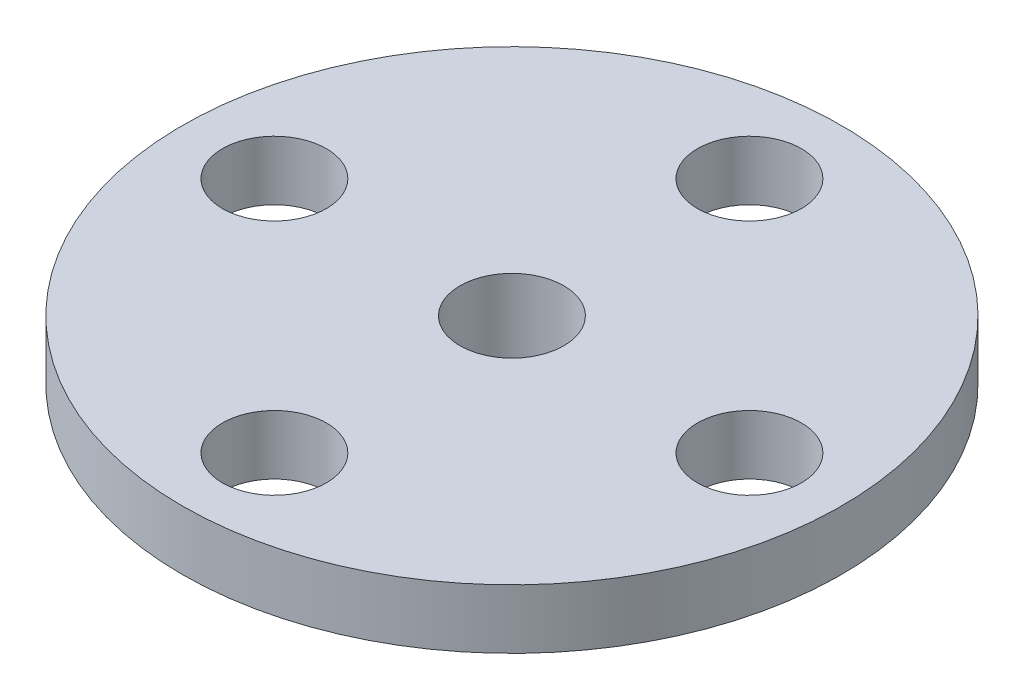
ISO-10303-21;
HEADER;
FILE_DESCRIPTION(('STEP AP214'),'2;1');
FILE_NAME('part.step','',(''),(''),'','','');
FILE_SCHEMA(('AUTOMOTIVE_DESIGN { 1 0 10303 214 1 1 1 1 }'));
ENDSEC;
DATA;
#1=APPLICATION_CONTEXT('core data for automotive mechanical design processes');
#2=APPLICATION_PROTOCOL_DEFINITION('international standard','automotive_design',2000,#1);
#3=PRODUCT_CONTEXT('',#1,'mechanical');
#4=PRODUCT('Part','Part','',(#3));
#5=PRODUCT_RELATED_PRODUCT_CATEGORY('part','',(#4));
#6=PRODUCT_DEFINITION_FORMATION('','',#4);
#7=PRODUCT_DEFINITION_CONTEXT('part definition',#1,'design');
#8=PRODUCT_DEFINITION('design','',#6,#7);
#9=PRODUCT_DEFINITION_SHAPE('','',#8);
#10=(LENGTH_UNIT() NAMED_UNIT(*) SI_UNIT(.MILLI.,.METRE.));
#11=(NAMED_UNIT(*) PLANE_ANGLE_UNIT() SI_UNIT($,.RADIAN.));
#12=(NAMED_UNIT(*) SI_UNIT($,.STERADIAN.) SOLID_ANGLE_UNIT());
#13=UNCERTAINTY_MEASURE_WITH_UNIT(LENGTH_MEASURE(1.E-05),#10,'distance_accuracy_value','');
#14=(GEOMETRIC_REPRESENTATION_CONTEXT(3) GLOBAL_UNCERTAINTY_ASSIGNED_CONTEXT((#13)) GLOBAL_UNIT_ASSIGNED_CONTEXT((#10,
#11,#12)) REPRESENTATION_CONTEXT('',''));
#15=CARTESIAN_POINT('',(0.,0.,0.));
#16=DIRECTION('',(0.,0.,1.));
#17=DIRECTION('',(1.,0.,0.));
#18=AXIS2_PLACEMENT_3D('',#15,#16,#17);
#19=CARTESIAN_POINT('',(0.,0.,0.));
#20=DIRECTION('',(0.,1.,0.));
#21=DIRECTION('',(0.,0.,1.));
#22=AXIS2_PLACEMENT_3D('',#19,#20,#21);
#23=PLANE('',#22);
#24=CARTESIAN_POINT('',(0.,0.,0.));
#25=DIRECTION('',(0.,1.,0.));
#26=DIRECTION('',(0.,0.,1.));
#27=AXIS2_PLACEMENT_3D('',#24,#25,#26);
#28=CIRCLE('',#27,11.1);
#29=CARTESIAN_POINT('',(0.,0.,11.1));
#30=VERTEX_POINT('',#29);
#31=EDGE_CURVE('E40',#30,#30,#28,.T.);
#32=ORIENTED_EDGE('',*,*,#31,.F.);
#33=EDGE_LOOP('',(#32));
#34=FACE_BOUND('',#33,.T.);
#35=CARTESIAN_POINT('',(0.,0.,-8.));
#36=DIRECTION('',(0.,1.,0.));
#37=DIRECTION('',(0.,0.,1.));
#38=AXIS2_PLACEMENT_3D('',#35,#36,#37);
#39=CIRCLE('',#38,1.75);
#40=CARTESIAN_POINT('',(0.,0.,-6.25));
#41=VERTEX_POINT('',#40);
#42=EDGE_CURVE('E45',#41,#41,#39,.T.);
#43=ORIENTED_EDGE('',*,*,#42,.T.);
#44=EDGE_LOOP('',(#43));
#45=FACE_BOUND('',#44,.T.);
#46=CARTESIAN_POINT('',(8.,0.,0.));
#47=DIRECTION('',(0.,1.,0.));
#48=DIRECTION('',(0.,0.,1.));
#49=AXIS2_PLACEMENT_3D('',#46,#47,#48);
#50=CIRCLE('',#49,1.75);
#51=CARTESIAN_POINT('',(8.,0.,1.75));
#52=VERTEX_POINT('',#51);
#53=EDGE_CURVE('E50',#52,#52,#50,.T.);
#54=ORIENTED_EDGE('',*,*,#53,.T.);
#55=EDGE_LOOP('',(#54));
#56=FACE_BOUND('',#55,.T.);
#57=CARTESIAN_POINT('',(0.,0.,8.));
#58=DIRECTION('',(0.,1.,0.));
#59=DIRECTION('',(0.,0.,1.));
#60=AXIS2_PLACEMENT_3D('',#57,#58,#59);
#61=CIRCLE('',#60,1.75);
#62=CARTESIAN_POINT('',(0.,0.,9.75));
#63=VERTEX_POINT('',#62);
#64=EDGE_CURVE('E56',#63,#63,#61,.T.);
#65=ORIENTED_EDGE('',*,*,#64,.T.);
#66=EDGE_LOOP('',(#65));
#67=FACE_BOUND('',#66,.T.);
#68=CARTESIAN_POINT('',(-8.,0.,0.));
#69=DIRECTION('',(0.,1.,0.));
#70=DIRECTION('',(0.,0.,1.));
#71=AXIS2_PLACEMENT_3D('',#68,#69,#70);
#72=CIRCLE('',#71,1.75);
#73=CARTESIAN_POINT('',(-8.,0.,1.75));
#74=VERTEX_POINT('',#73);
#75=EDGE_CURVE('E62',#74,#74,#72,.T.);
#76=ORIENTED_EDGE('',*,*,#75,.T.);
#77=EDGE_LOOP('',(#76));
#78=FACE_BOUND('',#77,.T.);
#79=CARTESIAN_POINT('',(0.,0.,0.));
#80=DIRECTION('',(0.,1.,0.));
#81=DIRECTION('',(0.,0.,1.));
#82=AXIS2_PLACEMENT_3D('',#79,#80,#81);
#83=CIRCLE('',#82,4.4);
#84=CARTESIAN_POINT('',(0.,0.,4.4));
#85=VERTEX_POINT('',#84);
#86=EDGE_CURVE('E10',#85,#85,#83,.F.);
#87=ORIENTED_EDGE('',*,*,#86,.F.);
#88=EDGE_LOOP('',(#87));
#89=FACE_BOUND('',#88,.T.);
#90=ADVANCED_FACE('F29',(#34,#45,#56,#67,#78,#89),#23,.F.);
#91=CARTESIAN_POINT('',(0.,2.,0.));
#92=DIRECTION('',(0.,-1.,0.));
#93=DIRECTION('',(0.,0.,-1.));
#94=AXIS2_PLACEMENT_3D('',#91,#92,#93);
#95=CYLINDRICAL_SURFACE('',#94,11.1);
#96=CARTESIAN_POINT('',(0.,2.,0.));
#97=DIRECTION('',(0.,1.,0.));
#98=DIRECTION('',(0.,0.,1.));
#99=AXIS2_PLACEMENT_3D('',#96,#97,#98);
#100=CIRCLE('',#99,11.1);
#101=CARTESIAN_POINT('',(0.,2.,11.1));
#102=VERTEX_POINT('',#101);
#103=EDGE_CURVE('E36',#102,#102,#100,.T.);
#104=ORIENTED_EDGE('',*,*,#103,.F.);
#105=EDGE_LOOP('',(#104));
#106=FACE_BOUND('',#105,.T.);
#107=ORIENTED_EDGE('',*,*,#31,.T.);
#108=EDGE_LOOP('',(#107));
#109=FACE_BOUND('',#108,.T.);
#110=ADVANCED_FACE('F31',(#106,#109),#95,.T.);
#111=CARTESIAN_POINT('',(0.,2.,0.));
#112=DIRECTION('',(0.,1.,0.));
#113=DIRECTION('',(0.,0.,1.));
#114=AXIS2_PLACEMENT_3D('',#111,#112,#113);
#115=PLANE('',#114);
#116=CARTESIAN_POINT('',(0.,2.,0.));
#117=DIRECTION('',(0.,-1.,0.));
#118=DIRECTION('',(0.,0.,-1.));
#119=AXIS2_PLACEMENT_3D('',#116,#117,#118);
#120=CIRCLE('',#119,1.75);
#121=CARTESIAN_POINT('',(0.,2.,-1.75));
#122=VERTEX_POINT('',#121);
#123=EDGE_CURVE('E77',#122,#122,#120,.T.);
#124=ORIENTED_EDGE('',*,*,#123,.T.);
#125=EDGE_LOOP('',(#124));
#126=FACE_BOUND('',#125,.T.);
#127=CARTESIAN_POINT('',(-8.,2.,0.));
#128=DIRECTION('',(0.,1.,0.));
#129=DIRECTION('',(0.,0.,1.));
#130=AXIS2_PLACEMENT_3D('',#127,#128,#129);
#131=CIRCLE('',#130,1.75);
#132=CARTESIAN_POINT('',(-8.,2.,1.75));
#133=VERTEX_POINT('',#132);
#134=EDGE_CURVE('E65',#133,#133,#131,.T.);
#135=ORIENTED_EDGE('',*,*,#134,.F.);
#136=EDGE_LOOP('',(#135));
#137=FACE_BOUND('',#136,.T.);
#138=CARTESIAN_POINT('',(0.,2.,8.));
#139=DIRECTION('',(0.,1.,0.));
#140=DIRECTION('',(0.,0.,1.));
#141=AXIS2_PLACEMENT_3D('',#138,#139,#140);
#142=CIRCLE('',#141,1.75);
#143=CARTESIAN_POINT('',(0.,2.,9.75));
#144=VERTEX_POINT('',#143);
#145=EDGE_CURVE('E59',#144,#144,#142,.T.);
#146=ORIENTED_EDGE('',*,*,#145,.F.);
#147=EDGE_LOOP('',(#146));
#148=FACE_BOUND('',#147,.T.);
#149=CARTESIAN_POINT('',(8.,2.,0.));
#150=DIRECTION('',(0.,1.,0.));
#151=DIRECTION('',(0.,0.,1.));
#152=AXIS2_PLACEMENT_3D('',#149,#150,#151);
#153=CIRCLE('',#152,1.75);
#154=CARTESIAN_POINT('',(8.,2.,1.75));
#155=VERTEX_POINT('',#154);
#156=EDGE_CURVE('E53',#155,#155,#153,.T.);
#157=ORIENTED_EDGE('',*,*,#156,.F.);
#158=EDGE_LOOP('',(#157));
#159=FACE_BOUND('',#158,.T.);
#160=CARTESIAN_POINT('',(0.,2.,-8.));
#161=DIRECTION('',(0.,1.,0.));
#162=DIRECTION('',(0.,0.,1.));
#163=AXIS2_PLACEMENT_3D('',#160,#161,#162);
#164=CIRCLE('',#163,1.75);
#165=CARTESIAN_POINT('',(0.,2.,-6.25));
#166=VERTEX_POINT('',#165);
#167=EDGE_CURVE('E47',#166,#166,#164,.T.);
#168=ORIENTED_EDGE('',*,*,#167,.F.);
#169=EDGE_LOOP('',(#168));
#170=FACE_BOUND('',#169,.T.);
#171=ORIENTED_EDGE('',*,*,#103,.T.);
#172=EDGE_LOOP('',(#171));
#173=FACE_BOUND('',#172,.T.);
#174=ADVANCED_FACE('F86',(#126,#137,#148,#159,#170,#173),#115,.T.);
#175=CARTESIAN_POINT('',(0.,0.,-8.));
#176=DIRECTION('',(0.,1.,0.));
#177=DIRECTION('',(0.,0.,1.));
#178=AXIS2_PLACEMENT_3D('',#175,#176,#177);
#179=CYLINDRICAL_SURFACE('',#178,1.75);
#180=ORIENTED_EDGE('',*,*,#42,.F.);
#181=EDGE_LOOP('',(#180));
#182=FACE_BOUND('',#181,.T.);
#183=ORIENTED_EDGE('',*,*,#167,.T.);
#184=EDGE_LOOP('',(#183));
#185=FACE_BOUND('',#184,.T.);
#186=ADVANCED_FACE('F134',(#182,#185),#179,.F.);
#187=CARTESIAN_POINT('',(8.,0.,0.));
#188=DIRECTION('',(0.,1.,0.));
#189=DIRECTION('',(0.,0.,1.));
#190=AXIS2_PLACEMENT_3D('',#187,#188,#189);
#191=CYLINDRICAL_SURFACE('',#190,1.75);
#192=ORIENTED_EDGE('',*,*,#53,.F.);
#193=EDGE_LOOP('',(#192));
#194=FACE_BOUND('',#193,.T.);
#195=ORIENTED_EDGE('',*,*,#156,.T.);
#196=EDGE_LOOP('',(#195));
#197=FACE_BOUND('',#196,.T.);
#198=ADVANCED_FACE('F137',(#194,#197),#191,.F.);
#199=CARTESIAN_POINT('',(0.,0.,8.));
#200=DIRECTION('',(0.,1.,0.));
#201=DIRECTION('',(0.,0.,1.));
#202=AXIS2_PLACEMENT_3D('',#199,#200,#201);
#203=CYLINDRICAL_SURFACE('',#202,1.75);
#204=ORIENTED_EDGE('',*,*,#64,.F.);
#205=EDGE_LOOP('',(#204));
#206=FACE_BOUND('',#205,.T.);
#207=ORIENTED_EDGE('',*,*,#145,.T.);
#208=EDGE_LOOP('',(#207));
#209=FACE_BOUND('',#208,.T.);
#210=ADVANCED_FACE('F120',(#206,#209),#203,.F.);
#211=CARTESIAN_POINT('',(-8.,0.,0.));
#212=DIRECTION('',(0.,1.,0.));
#213=DIRECTION('',(0.,0.,1.));
#214=AXIS2_PLACEMENT_3D('',#211,#212,#213);
#215=CYLINDRICAL_SURFACE('',#214,1.75);
#216=ORIENTED_EDGE('',*,*,#75,.F.);
#217=EDGE_LOOP('',(#216));
#218=FACE_BOUND('',#217,.T.);
#219=ORIENTED_EDGE('',*,*,#134,.T.);
#220=EDGE_LOOP('',(#219));
#221=FACE_BOUND('',#220,.T.);
#222=ADVANCED_FACE('F115',(#218,#221),#215,.F.);
#223=CARTESIAN_POINT('',(0.,-4.2,0.));
#224=DIRECTION('',(0.,1.,0.));
#225=DIRECTION('',(0.,0.,1.));
#226=AXIS2_PLACEMENT_3D('',#223,#224,#225);
#227=CYLINDRICAL_SURFACE('',#226,4.4);
#228=CARTESIAN_POINT('',(0.,-4.2,0.));
#229=DIRECTION('',(0.,-1.,0.));
#230=DIRECTION('',(0.,0.,-1.));
#231=AXIS2_PLACEMENT_3D('',#228,#229,#230);
#232=CIRCLE('',#231,4.4);
#233=CARTESIAN_POINT('',(0.,-4.2,-4.4));
#234=VERTEX_POINT('',#233);
#235=EDGE_CURVE('E68',#234,#234,#232,.T.);
#236=ORIENTED_EDGE('',*,*,#235,.F.);
#237=EDGE_LOOP('',(#236));
#238=FACE_BOUND('',#237,.T.);
#239=ORIENTED_EDGE('',*,*,#86,.T.);
#240=EDGE_LOOP('',(#239));
#241=FACE_BOUND('',#240,.T.);
#242=ADVANCED_FACE('F110',(#238,#241),#227,.T.);
#243=CARTESIAN_POINT('',(0.,-4.2,0.));
#244=DIRECTION('',(0.,-1.,0.));
#245=DIRECTION('',(0.,0.,-1.));
#246=AXIS2_PLACEMENT_3D('',#243,#244,#245);
#247=PLANE('',#246);
#248=CARTESIAN_POINT('',(0.,-4.2,0.));
#249=DIRECTION('',(0.,-1.,0.));
#250=DIRECTION('',(0.,0.,-1.));
#251=AXIS2_PLACEMENT_3D('',#248,#249,#250);
#252=CIRCLE('',#251,2.85);
#253=CARTESIAN_POINT('',(0.,-4.2,-2.85));
#254=VERTEX_POINT('',#253);
#255=EDGE_CURVE('E74',#254,#254,#252,.T.);
#256=ORIENTED_EDGE('',*,*,#255,.F.);
#257=EDGE_LOOP('',(#256));
#258=FACE_BOUND('',#257,.T.);
#259=ORIENTED_EDGE('',*,*,#235,.T.);
#260=EDGE_LOOP('',(#259));
#261=FACE_BOUND('',#260,.T.);
#262=ADVANCED_FACE('F104',(#258,#261),#247,.T.);
#263=CARTESIAN_POINT('',(0.,-1.2,0.));
#264=DIRECTION('',(0.,-1.,0.));
#265=DIRECTION('',(0.,0.,-1.));
#266=AXIS2_PLACEMENT_3D('',#263,#264,#265);
#267=CYLINDRICAL_SURFACE('',#266,2.85);
#268=CARTESIAN_POINT('',(0.,-1.2,0.));
#269=DIRECTION('',(0.,-1.,0.));
#270=DIRECTION('',(0.,0.,-1.));
#271=AXIS2_PLACEMENT_3D('',#268,#269,#270);
#272=CIRCLE('',#271,2.85);
#273=CARTESIAN_POINT('',(0.,-1.2,-2.85));
#274=VERTEX_POINT('',#273);
#275=EDGE_CURVE('E73',#274,#274,#272,.T.);
#276=ORIENTED_EDGE('',*,*,#275,.F.);
#277=EDGE_LOOP('',(#276));
#278=FACE_BOUND('',#277,.T.);
#279=ORIENTED_EDGE('',*,*,#255,.T.);
#280=EDGE_LOOP('',(#279));
#281=FACE_BOUND('',#280,.T.);
#282=ADVANCED_FACE('F98',(#278,#281),#267,.F.);
#283=CARTESIAN_POINT('',(0.,-1.2,0.));
#284=DIRECTION('',(0.,-1.,0.));
#285=DIRECTION('',(0.,0.,-1.));
#286=AXIS2_PLACEMENT_3D('',#283,#284,#285);
#287=PLANE('',#286);
#288=CARTESIAN_POINT('',(0.,-1.2,0.));
#289=DIRECTION('',(0.,-1.,0.));
#290=DIRECTION('',(0.,0.,-1.));
#291=AXIS2_PLACEMENT_3D('',#288,#289,#290);
#292=CIRCLE('',#291,1.75);
#293=CARTESIAN_POINT('',(0.,-1.2,-1.75));
#294=VERTEX_POINT('',#293);
#295=EDGE_CURVE('E80',#294,#294,#292,.T.);
#296=ORIENTED_EDGE('',*,*,#295,.F.);
#297=EDGE_LOOP('',(#296));
#298=FACE_BOUND('',#297,.T.);
#299=ORIENTED_EDGE('',*,*,#275,.T.);
#300=EDGE_LOOP('',(#299));
#301=FACE_BOUND('',#300,.T.);
#302=ADVANCED_FACE('F92',(#298,#301),#287,.T.);
#303=CARTESIAN_POINT('',(0.,2.,0.));
#304=DIRECTION('',(0.,-1.,0.));
#305=DIRECTION('',(0.,0.,-1.));
#306=AXIS2_PLACEMENT_3D('',#303,#304,#305);
#307=CYLINDRICAL_SURFACE('',#306,1.75);
#308=ORIENTED_EDGE('',*,*,#123,.F.);
#309=EDGE_LOOP('',(#308));
#310=FACE_BOUND('',#309,.T.);
#311=ORIENTED_EDGE('',*,*,#295,.T.);
#312=EDGE_LOOP('',(#311));
#313=FACE_BOUND('',#312,.T.);
#314=ADVANCED_FACE('F89',(#310,#313),#307,.F.);
#315=CLOSED_SHELL('',(#90,#110,#174,#186,#198,#210,#222,#242,#262,#282,#302,#314));
#316=MANIFOLD_SOLID_BREP('B2',#315);
#317=ADVANCED_BREP_SHAPE_REPRESENTATION('',(#18,#316),#14);
#318=SHAPE_DEFINITION_REPRESENTATION(#9,#317);
ENDSEC;
END-ISO-10303-21;
